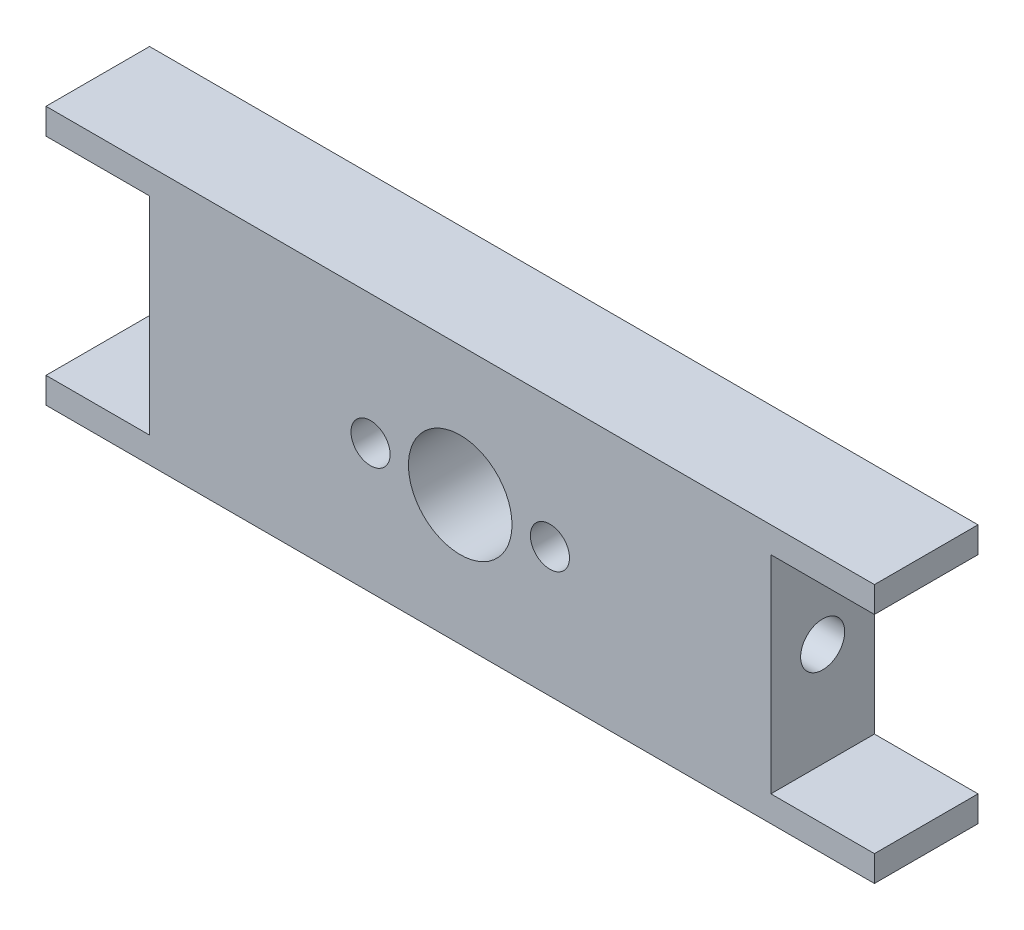
ISO-10303-21;
HEADER;
FILE_DESCRIPTION(('STEP AP214'),'2;1');
FILE_NAME('part.step','',(''),(''),'','','');
FILE_SCHEMA(('AUTOMOTIVE_DESIGN { 1 0 10303 214 1 1 1 1 }'));
ENDSEC;
DATA;
#1=APPLICATION_CONTEXT('core data for automotive mechanical design processes');
#2=APPLICATION_PROTOCOL_DEFINITION('international standard','automotive_design',2000,#1);
#3=PRODUCT_CONTEXT('',#1,'mechanical');
#4=PRODUCT('Part','Part','',(#3));
#5=PRODUCT_RELATED_PRODUCT_CATEGORY('part','',(#4));
#6=PRODUCT_DEFINITION_FORMATION('','',#4);
#7=PRODUCT_DEFINITION_CONTEXT('part definition',#1,'design');
#8=PRODUCT_DEFINITION('design','',#6,#7);
#9=PRODUCT_DEFINITION_SHAPE('','',#8);
#10=(LENGTH_UNIT() NAMED_UNIT(*) SI_UNIT(.MILLI.,.METRE.));
#11=(NAMED_UNIT(*) PLANE_ANGLE_UNIT() SI_UNIT($,.RADIAN.));
#12=(NAMED_UNIT(*) SI_UNIT($,.STERADIAN.) SOLID_ANGLE_UNIT());
#13=UNCERTAINTY_MEASURE_WITH_UNIT(LENGTH_MEASURE(1.E-05),#10,'distance_accuracy_value','');
#14=(GEOMETRIC_REPRESENTATION_CONTEXT(3) GLOBAL_UNCERTAINTY_ASSIGNED_CONTEXT((#13)) GLOBAL_UNIT_ASSIGNED_CONTEXT((#10,
#11,#12)) REPRESENTATION_CONTEXT('',''));
#15=CARTESIAN_POINT('',(0.,0.,0.));
#16=DIRECTION('',(0.,0.,1.));
#17=DIRECTION('',(1.,0.,0.));
#18=AXIS2_PLACEMENT_3D('',#15,#16,#17);
#19=CARTESIAN_POINT('',(0.,0.,6.35));
#20=DIRECTION('',(0.,0.,-1.));
#21=DIRECTION('',(-1.,0.,0.));
#22=AXIS2_PLACEMENT_3D('',#19,#20,#21);
#23=PLANE('',#22);
#24=CARTESIAN_POINT('',(5.50000000000001,0.,6.34999999999999));
#25=DIRECTION('',(0.,0.,-1.));
#26=DIRECTION('',(-1.,0.,0.));
#27=AXIS2_PLACEMENT_3D('',#24,#25,#26);
#28=CIRCLE('',#27,1.19999999999999);
#29=CARTESIAN_POINT('',(4.30000000000002,0.,6.34999999999999));
#30=VERTEX_POINT('',#29);
#31=EDGE_CURVE('E321',#30,#30,#28,.T.);
#32=ORIENTED_EDGE('',*,*,#31,.T.);
#33=EDGE_LOOP('',(#32));
#34=FACE_BOUND('',#33,.T.);
#35=CARTESIAN_POINT('',(-5.5,0.,6.34999999999999));
#36=DIRECTION('',(0.,0.,-1.));
#37=DIRECTION('',(-1.,0.,0.));
#38=AXIS2_PLACEMENT_3D('',#35,#36,#37);
#39=CIRCLE('',#38,1.19999999999999);
#40=CARTESIAN_POINT('',(-6.69999999999999,0.,6.34999999999999));
#41=VERTEX_POINT('',#40);
#42=EDGE_CURVE('E329',#41,#41,#39,.T.);
#43=ORIENTED_EDGE('',*,*,#42,.T.);
#44=EDGE_LOOP('',(#43));
#45=FACE_BOUND('',#44,.T.);
#46=DIRECTION('',(0.,1.,0.));
#47=VECTOR('',#46,1.);
#48=CARTESIAN_POINT('',(25.4,7.9375,6.35));
#49=LINE('',#48,#47);
#50=CARTESIAN_POINT('',(25.4,6.35,6.35));
#51=VERTEX_POINT('',#50);
#52=CARTESIAN_POINT('',(25.4,7.9375,6.35));
#53=VERTEX_POINT('',#52);
#54=EDGE_CURVE('E180',#51,#53,#49,.T.);
#55=ORIENTED_EDGE('',*,*,#54,.T.);
#56=DIRECTION('',(-1.,0.,0.));
#57=VECTOR('',#56,1.);
#58=CARTESIAN_POINT('',(25.4,7.9375,6.35));
#59=LINE('',#58,#57);
#60=CARTESIAN_POINT('',(-25.4,7.9375,6.35));
#61=VERTEX_POINT('',#60);
#62=EDGE_CURVE('E106',#53,#61,#59,.T.);
#63=ORIENTED_EDGE('',*,*,#62,.T.);
#64=DIRECTION('',(0.,-1.,0.));
#65=VECTOR('',#64,1.);
#66=CARTESIAN_POINT('',(-25.4,7.9375,6.35));
#67=LINE('',#66,#65);
#68=CARTESIAN_POINT('',(-25.4,6.35,6.35));
#69=VERTEX_POINT('',#68);
#70=EDGE_CURVE('E207',#61,#69,#67,.T.);
#71=ORIENTED_EDGE('',*,*,#70,.T.);
#72=DIRECTION('',(1.,0.,0.));
#73=VECTOR('',#72,1.);
#74=CARTESIAN_POINT('',(-25.4,6.35,6.35));
#75=LINE('',#74,#73);
#76=CARTESIAN_POINT('',(-19.05,6.35,6.35));
#77=VERTEX_POINT('',#76);
#78=EDGE_CURVE('E226',#69,#77,#75,.T.);
#79=ORIENTED_EDGE('',*,*,#78,.T.);
#80=DIRECTION('',(0.,-1.,0.));
#81=VECTOR('',#80,1.);
#82=CARTESIAN_POINT('',(-19.05,6.35,6.35));
#83=LINE('',#82,#81);
#84=CARTESIAN_POINT('',(-19.05,-6.35,6.35));
#85=VERTEX_POINT('',#84);
#86=EDGE_CURVE('E223',#77,#85,#83,.T.);
#87=ORIENTED_EDGE('',*,*,#86,.T.);
#88=DIRECTION('',(-1.,0.,0.));
#89=VECTOR('',#88,1.);
#90=CARTESIAN_POINT('',(-25.4,-6.35,6.35));
#91=LINE('',#90,#89);
#92=CARTESIAN_POINT('',(-25.4,-6.35,6.35));
#93=VERTEX_POINT('',#92);
#94=EDGE_CURVE('E225',#85,#93,#91,.T.);
#95=ORIENTED_EDGE('',*,*,#94,.T.);
#96=DIRECTION('',(0.,-1.,0.));
#97=VECTOR('',#96,1.);
#98=CARTESIAN_POINT('',(-25.4,-6.35,6.35));
#99=LINE('',#98,#97);
#100=CARTESIAN_POINT('',(-25.4,-7.9375,6.35));
#101=VERTEX_POINT('',#100);
#102=EDGE_CURVE('E228',#93,#101,#99,.T.);
#103=ORIENTED_EDGE('',*,*,#102,.T.);
#104=DIRECTION('',(1.,0.,0.));
#105=VECTOR('',#104,1.);
#106=CARTESIAN_POINT('',(25.4,-7.9375,6.35));
#107=LINE('',#106,#105);
#108=CARTESIAN_POINT('',(25.4,-7.9375,6.35));
#109=VERTEX_POINT('',#108);
#110=EDGE_CURVE('E234',#101,#109,#107,.T.);
#111=ORIENTED_EDGE('',*,*,#110,.T.);
#112=DIRECTION('',(0.,1.,0.));
#113=VECTOR('',#112,1.);
#114=CARTESIAN_POINT('',(25.4,-6.35,6.35));
#115=LINE('',#114,#113);
#116=CARTESIAN_POINT('',(25.4,-6.35,6.35));
#117=VERTEX_POINT('',#116);
#118=EDGE_CURVE('E139',#109,#117,#115,.T.);
#119=ORIENTED_EDGE('',*,*,#118,.T.);
#120=DIRECTION('',(-1.,0.,0.));
#121=VECTOR('',#120,1.);
#122=CARTESIAN_POINT('',(25.4,-6.35,6.35));
#123=LINE('',#122,#121);
#124=CARTESIAN_POINT('',(19.05,-6.35,6.35));
#125=VERTEX_POINT('',#124);
#126=EDGE_CURVE('E133',#117,#125,#123,.T.);
#127=ORIENTED_EDGE('',*,*,#126,.T.);
#128=DIRECTION('',(0.,1.,0.));
#129=VECTOR('',#128,1.);
#130=CARTESIAN_POINT('',(19.05,6.35,6.35));
#131=LINE('',#130,#129);
#132=CARTESIAN_POINT('',(19.05,6.35,6.35));
#133=VERTEX_POINT('',#132);
#134=EDGE_CURVE('E137',#125,#133,#131,.T.);
#135=ORIENTED_EDGE('',*,*,#134,.T.);
#136=DIRECTION('',(1.,0.,0.));
#137=VECTOR('',#136,1.);
#138=CARTESIAN_POINT('',(25.4,6.35,6.35));
#139=LINE('',#138,#137);
#140=EDGE_CURVE('E50',#133,#51,#139,.T.);
#141=ORIENTED_EDGE('',*,*,#140,.T.);
#142=EDGE_LOOP('',(#55,#63,#71,#79,#87,#95,#103,#111,#119,#127,#135,#141));
#143=FACE_BOUND('',#142,.T.);
#144=CARTESIAN_POINT('',(0.,0.,6.35));
#145=DIRECTION('',(0.,0.,1.));
#146=DIRECTION('',(1.,0.,0.));
#147=AXIS2_PLACEMENT_3D('',#144,#145,#146);
#148=CIRCLE('',#147,3.175);
#149=CARTESIAN_POINT('',(3.175,0.,6.35));
#150=VERTEX_POINT('',#149);
#151=EDGE_CURVE('E161',#150,#150,#148,.T.);
#152=ORIENTED_EDGE('',*,*,#151,.F.);
#153=EDGE_LOOP('',(#152));
#154=FACE_BOUND('',#153,.T.);
#155=ADVANCED_FACE('F33',(#34,#45,#143,#154),#23,.F.);
#156=CARTESIAN_POINT('',(0.,0.,0.));
#157=DIRECTION('',(0.,0.,-1.));
#158=DIRECTION('',(-1.,0.,0.));
#159=AXIS2_PLACEMENT_3D('',#156,#157,#158);
#160=PLANE('',#159);
#161=CARTESIAN_POINT('',(5.50000000000001,0.,0.));
#162=DIRECTION('',(0.,0.,-1.));
#163=DIRECTION('',(-1.,0.,0.));
#164=AXIS2_PLACEMENT_3D('',#161,#162,#163);
#165=CIRCLE('',#164,1.225);
#166=CARTESIAN_POINT('',(4.275,0.,0.));
#167=VERTEX_POINT('',#166);
#168=EDGE_CURVE('E313',#167,#167,#165,.T.);
#169=ORIENTED_EDGE('',*,*,#168,.F.);
#170=EDGE_LOOP('',(#169));
#171=FACE_BOUND('',#170,.T.);
#172=CARTESIAN_POINT('',(-5.5,0.,0.));
#173=DIRECTION('',(0.,0.,-1.));
#174=DIRECTION('',(-1.,0.,0.));
#175=AXIS2_PLACEMENT_3D('',#172,#173,#174);
#176=CIRCLE('',#175,1.225);
#177=CARTESIAN_POINT('',(-6.725,0.,0.));
#178=VERTEX_POINT('',#177);
#179=EDGE_CURVE('E323',#178,#178,#176,.T.);
#180=ORIENTED_EDGE('',*,*,#179,.F.);
#181=EDGE_LOOP('',(#180));
#182=FACE_BOUND('',#181,.T.);
#183=DIRECTION('',(0.,1.,0.));
#184=VECTOR('',#183,1.);
#185=CARTESIAN_POINT('',(25.4,7.9375,0.));
#186=LINE('',#185,#184);
#187=CARTESIAN_POINT('',(25.4,6.35,0.));
#188=VERTEX_POINT('',#187);
#189=CARTESIAN_POINT('',(25.4,7.9375,0.));
#190=VERTEX_POINT('',#189);
#191=EDGE_CURVE('E157',#188,#190,#186,.T.);
#192=ORIENTED_EDGE('',*,*,#191,.F.);
#193=DIRECTION('',(1.,0.,0.));
#194=VECTOR('',#193,1.);
#195=CARTESIAN_POINT('',(25.4,6.35,0.));
#196=LINE('',#195,#194);
#197=CARTESIAN_POINT('',(19.05,6.35,0.));
#198=VERTEX_POINT('',#197);
#199=EDGE_CURVE('E98',#198,#188,#196,.T.);
#200=ORIENTED_EDGE('',*,*,#199,.F.);
#201=DIRECTION('',(0.,1.,0.));
#202=VECTOR('',#201,1.);
#203=CARTESIAN_POINT('',(19.05,6.35,0.));
#204=LINE('',#203,#202);
#205=CARTESIAN_POINT('',(19.05,-6.35,0.));
#206=VERTEX_POINT('',#205);
#207=EDGE_CURVE('E92',#206,#198,#204,.T.);
#208=ORIENTED_EDGE('',*,*,#207,.F.);
#209=DIRECTION('',(-1.,0.,0.));
#210=VECTOR('',#209,1.);
#211=CARTESIAN_POINT('',(25.4,-6.35,0.));
#212=LINE('',#211,#210);
#213=CARTESIAN_POINT('',(25.4,-6.35,0.));
#214=VERTEX_POINT('',#213);
#215=EDGE_CURVE('E147',#214,#206,#212,.T.);
#216=ORIENTED_EDGE('',*,*,#215,.F.);
#217=DIRECTION('',(0.,1.,0.));
#218=VECTOR('',#217,1.);
#219=CARTESIAN_POINT('',(25.4,-6.35,0.));
#220=LINE('',#219,#218);
#221=CARTESIAN_POINT('',(25.4,-7.9375,0.));
#222=VERTEX_POINT('',#221);
#223=EDGE_CURVE('E175',#222,#214,#220,.T.);
#224=ORIENTED_EDGE('',*,*,#223,.F.);
#225=DIRECTION('',(1.,0.,0.));
#226=VECTOR('',#225,1.);
#227=CARTESIAN_POINT('',(25.4,-7.9375,0.));
#228=LINE('',#227,#226);
#229=CARTESIAN_POINT('',(-25.4,-7.9375,0.));
#230=VERTEX_POINT('',#229);
#231=EDGE_CURVE('E173',#230,#222,#228,.T.);
#232=ORIENTED_EDGE('',*,*,#231,.F.);
#233=DIRECTION('',(0.,-1.,0.));
#234=VECTOR('',#233,1.);
#235=CARTESIAN_POINT('',(-25.4,-6.35,0.));
#236=LINE('',#235,#234);
#237=CARTESIAN_POINT('',(-25.4,-6.35,0.));
#238=VERTEX_POINT('',#237);
#239=EDGE_CURVE('E171',#238,#230,#236,.T.);
#240=ORIENTED_EDGE('',*,*,#239,.F.);
#241=DIRECTION('',(-1.,0.,0.));
#242=VECTOR('',#241,1.);
#243=CARTESIAN_POINT('',(-25.4,-6.35,0.));
#244=LINE('',#243,#242);
#245=CARTESIAN_POINT('',(-19.05,-6.35,0.));
#246=VERTEX_POINT('',#245);
#247=EDGE_CURVE('E169',#246,#238,#244,.T.);
#248=ORIENTED_EDGE('',*,*,#247,.F.);
#249=DIRECTION('',(0.,-1.,0.));
#250=VECTOR('',#249,1.);
#251=CARTESIAN_POINT('',(-19.05,6.35,0.));
#252=LINE('',#251,#250);
#253=CARTESIAN_POINT('',(-19.05,6.35,0.));
#254=VERTEX_POINT('',#253);
#255=EDGE_CURVE('E167',#254,#246,#252,.T.);
#256=ORIENTED_EDGE('',*,*,#255,.F.);
#257=DIRECTION('',(1.,0.,0.));
#258=VECTOR('',#257,1.);
#259=CARTESIAN_POINT('',(-25.4,6.35,0.));
#260=LINE('',#259,#258);
#261=CARTESIAN_POINT('',(-25.4,6.35,0.));
#262=VERTEX_POINT('',#261);
#263=EDGE_CURVE('E165',#262,#254,#260,.T.);
#264=ORIENTED_EDGE('',*,*,#263,.F.);
#265=DIRECTION('',(0.,-1.,0.));
#266=VECTOR('',#265,1.);
#267=CARTESIAN_POINT('',(-25.4,7.9375,0.));
#268=LINE('',#267,#266);
#269=CARTESIAN_POINT('',(-25.4,7.9375,0.));
#270=VERTEX_POINT('',#269);
#271=EDGE_CURVE('E163',#270,#262,#268,.T.);
#272=ORIENTED_EDGE('',*,*,#271,.F.);
#273=DIRECTION('',(-1.,0.,0.));
#274=VECTOR('',#273,1.);
#275=CARTESIAN_POINT('',(25.4,7.9375,0.));
#276=LINE('',#275,#274);
#277=EDGE_CURVE('E160',#190,#270,#276,.T.);
#278=ORIENTED_EDGE('',*,*,#277,.F.);
#279=EDGE_LOOP('',(#192,#200,#208,#216,#224,#232,#240,#248,#256,#264,#272,#278));
#280=FACE_BOUND('',#279,.T.);
#281=CARTESIAN_POINT('',(0.,0.,0.));
#282=DIRECTION('',(0.,0.,1.));
#283=DIRECTION('',(1.,0.,0.));
#284=AXIS2_PLACEMENT_3D('',#281,#282,#283);
#285=CIRCLE('',#284,3.175);
#286=CARTESIAN_POINT('',(3.175,0.,0.));
#287=VERTEX_POINT('',#286);
#288=EDGE_CURVE('E338',#287,#287,#285,.T.);
#289=ORIENTED_EDGE('',*,*,#288,.T.);
#290=EDGE_LOOP('',(#289));
#291=FACE_BOUND('',#290,.T.);
#292=ADVANCED_FACE('F211',(#171,#182,#280,#291),#160,.T.);
#293=CARTESIAN_POINT('',(25.4,7.9375,6.35));
#294=DIRECTION('',(-1.,0.,0.));
#295=DIRECTION('',(0.,0.,1.));
#296=AXIS2_PLACEMENT_3D('',#293,#294,#295);
#297=PLANE('',#296);
#298=ORIENTED_EDGE('',*,*,#191,.T.);
#299=DIRECTION('',(0.,0.,-1.));
#300=VECTOR('',#299,1.);
#301=CARTESIAN_POINT('',(25.4,7.9375,6.35));
#302=LINE('',#301,#300);
#303=EDGE_CURVE('E11',#53,#190,#302,.T.);
#304=ORIENTED_EDGE('',*,*,#303,.F.);
#305=ORIENTED_EDGE('',*,*,#54,.F.);
#306=DIRECTION('',(0.,0.,-1.));
#307=VECTOR('',#306,1.);
#308=CARTESIAN_POINT('',(25.4,6.35,6.35));
#309=LINE('',#308,#307);
#310=EDGE_CURVE('E153',#51,#188,#309,.T.);
#311=ORIENTED_EDGE('',*,*,#310,.T.);
#312=EDGE_LOOP('',(#298,#304,#305,#311));
#313=FACE_BOUND('',#312,.T.);
#314=ADVANCED_FACE('F35',(#313),#297,.F.);
#315=CARTESIAN_POINT('',(25.4,7.9375,6.35));
#316=DIRECTION('',(0.,-1.,0.));
#317=DIRECTION('',(1.,0.,0.));
#318=AXIS2_PLACEMENT_3D('',#315,#316,#317);
#319=PLANE('',#318);
#320=ORIENTED_EDGE('',*,*,#277,.T.);
#321=DIRECTION('',(0.,0.,-1.));
#322=VECTOR('',#321,1.);
#323=CARTESIAN_POINT('',(-25.4,7.9375,6.35));
#324=LINE('',#323,#322);
#325=EDGE_CURVE('E42',#61,#270,#324,.T.);
#326=ORIENTED_EDGE('',*,*,#325,.F.);
#327=ORIENTED_EDGE('',*,*,#62,.F.);
#328=ORIENTED_EDGE('',*,*,#303,.T.);
#329=EDGE_LOOP('',(#320,#326,#327,#328));
#330=FACE_BOUND('',#329,.T.);
#331=ADVANCED_FACE('F377',(#330),#319,.F.);
#332=CARTESIAN_POINT('',(-25.4,7.9375,6.35));
#333=DIRECTION('',(1.,0.,0.));
#334=DIRECTION('',(0.,0.,-1.));
#335=AXIS2_PLACEMENT_3D('',#332,#333,#334);
#336=PLANE('',#335);
#337=ORIENTED_EDGE('',*,*,#271,.T.);
#338=DIRECTION('',(0.,0.,-1.));
#339=VECTOR('',#338,1.);
#340=CARTESIAN_POINT('',(-25.4,6.35,6.35));
#341=LINE('',#340,#339);
#342=EDGE_CURVE('E199',#69,#262,#341,.T.);
#343=ORIENTED_EDGE('',*,*,#342,.F.);
#344=ORIENTED_EDGE('',*,*,#70,.F.);
#345=ORIENTED_EDGE('',*,*,#325,.T.);
#346=EDGE_LOOP('',(#337,#343,#344,#345));
#347=FACE_BOUND('',#346,.T.);
#348=ADVANCED_FACE('F205',(#347),#336,.F.);
#349=CARTESIAN_POINT('',(-25.4,6.35,6.35));
#350=DIRECTION('',(0.,1.,0.));
#351=DIRECTION('',(-1.,0.,0.));
#352=AXIS2_PLACEMENT_3D('',#349,#350,#351);
#353=PLANE('',#352);
#354=ORIENTED_EDGE('',*,*,#263,.T.);
#355=DIRECTION('',(0.,0.,-1.));
#356=VECTOR('',#355,1.);
#357=CARTESIAN_POINT('',(-19.05,6.35,6.35));
#358=LINE('',#357,#356);
#359=EDGE_CURVE('E196',#77,#254,#358,.T.);
#360=ORIENTED_EDGE('',*,*,#359,.F.);
#361=ORIENTED_EDGE('',*,*,#78,.F.);
#362=ORIENTED_EDGE('',*,*,#342,.T.);
#363=EDGE_LOOP('',(#354,#360,#361,#362));
#364=FACE_BOUND('',#363,.T.);
#365=ADVANCED_FACE('F217',(#364),#353,.F.);
#366=CARTESIAN_POINT('',(-19.05,6.35,6.35));
#367=DIRECTION('',(1.,0.,0.));
#368=DIRECTION('',(0.,0.,-1.));
#369=AXIS2_PLACEMENT_3D('',#366,#367,#368);
#370=PLANE('',#369);
#371=CARTESIAN_POINT('',(-19.05,-2.53269627492614E-13,3.17500000000133));
#372=DIRECTION('',(-1.,0.,0.));
#373=DIRECTION('',(0.,0.,1.));
#374=AXIS2_PLACEMENT_3D('',#371,#372,#373);
#375=CIRCLE('',#374,1.35254999999999);
#376=CARTESIAN_POINT('',(-19.05,-2.53269627492614E-13,4.52755000000132));
#377=VERTEX_POINT('',#376);
#378=EDGE_CURVE('E310',#377,#377,#375,.T.);
#379=ORIENTED_EDGE('',*,*,#378,.F.);
#380=EDGE_LOOP('',(#379));
#381=FACE_BOUND('',#380,.T.);
#382=ORIENTED_EDGE('',*,*,#255,.T.);
#383=DIRECTION('',(0.,0.,-1.));
#384=VECTOR('',#383,1.);
#385=CARTESIAN_POINT('',(-19.05,-6.35,6.35));
#386=LINE('',#385,#384);
#387=EDGE_CURVE('E193',#85,#246,#386,.T.);
#388=ORIENTED_EDGE('',*,*,#387,.F.);
#389=ORIENTED_EDGE('',*,*,#86,.F.);
#390=ORIENTED_EDGE('',*,*,#359,.T.);
#391=EDGE_LOOP('',(#382,#388,#389,#390));
#392=FACE_BOUND('',#391,.T.);
#393=ADVANCED_FACE('F221',(#381,#392),#370,.F.);
#394=CARTESIAN_POINT('',(-25.4,-6.35,6.35));
#395=DIRECTION('',(0.,-1.,0.));
#396=DIRECTION('',(1.,0.,0.));
#397=AXIS2_PLACEMENT_3D('',#394,#395,#396);
#398=PLANE('',#397);
#399=ORIENTED_EDGE('',*,*,#247,.T.);
#400=DIRECTION('',(0.,0.,-1.));
#401=VECTOR('',#400,1.);
#402=CARTESIAN_POINT('',(-25.4,-6.35,6.35));
#403=LINE('',#402,#401);
#404=EDGE_CURVE('E190',#93,#238,#403,.T.);
#405=ORIENTED_EDGE('',*,*,#404,.F.);
#406=ORIENTED_EDGE('',*,*,#94,.F.);
#407=ORIENTED_EDGE('',*,*,#387,.T.);
#408=EDGE_LOOP('',(#399,#405,#406,#407));
#409=FACE_BOUND('',#408,.T.);
#410=ADVANCED_FACE('F364',(#409),#398,.F.);
#411=CARTESIAN_POINT('',(-25.4,-6.35,6.35));
#412=DIRECTION('',(1.,0.,0.));
#413=DIRECTION('',(0.,0.,-1.));
#414=AXIS2_PLACEMENT_3D('',#411,#412,#413);
#415=PLANE('',#414);
#416=ORIENTED_EDGE('',*,*,#239,.T.);
#417=DIRECTION('',(0.,0.,-1.));
#418=VECTOR('',#417,1.);
#419=CARTESIAN_POINT('',(-25.4,-7.9375,6.35));
#420=LINE('',#419,#418);
#421=EDGE_CURVE('E187',#101,#230,#420,.T.);
#422=ORIENTED_EDGE('',*,*,#421,.F.);
#423=ORIENTED_EDGE('',*,*,#102,.F.);
#424=ORIENTED_EDGE('',*,*,#404,.T.);
#425=EDGE_LOOP('',(#416,#422,#423,#424));
#426=FACE_BOUND('',#425,.T.);
#427=ADVANCED_FACE('F370',(#426),#415,.F.);
#428=CARTESIAN_POINT('',(25.4,-7.9375,6.35));
#429=DIRECTION('',(0.,1.,0.));
#430=DIRECTION('',(-1.,0.,0.));
#431=AXIS2_PLACEMENT_3D('',#428,#429,#430);
#432=PLANE('',#431);
#433=ORIENTED_EDGE('',*,*,#231,.T.);
#434=DIRECTION('',(0.,0.,-1.));
#435=VECTOR('',#434,1.);
#436=CARTESIAN_POINT('',(25.4,-7.9375,6.35));
#437=LINE('',#436,#435);
#438=EDGE_CURVE('E184',#109,#222,#437,.T.);
#439=ORIENTED_EDGE('',*,*,#438,.F.);
#440=ORIENTED_EDGE('',*,*,#110,.F.);
#441=ORIENTED_EDGE('',*,*,#421,.T.);
#442=EDGE_LOOP('',(#433,#439,#440,#441));
#443=FACE_BOUND('',#442,.T.);
#444=ADVANCED_FACE('F240',(#443),#432,.F.);
#445=CARTESIAN_POINT('',(25.4,-6.35,6.35));
#446=DIRECTION('',(-1.,0.,0.));
#447=DIRECTION('',(0.,0.,1.));
#448=AXIS2_PLACEMENT_3D('',#445,#446,#447);
#449=PLANE('',#448);
#450=ORIENTED_EDGE('',*,*,#223,.T.);
#451=DIRECTION('',(0.,0.,-1.));
#452=VECTOR('',#451,1.);
#453=CARTESIAN_POINT('',(25.4,-6.35,6.35));
#454=LINE('',#453,#452);
#455=EDGE_CURVE('E148',#117,#214,#454,.T.);
#456=ORIENTED_EDGE('',*,*,#455,.F.);
#457=ORIENTED_EDGE('',*,*,#118,.F.);
#458=ORIENTED_EDGE('',*,*,#438,.T.);
#459=EDGE_LOOP('',(#450,#456,#457,#458));
#460=FACE_BOUND('',#459,.T.);
#461=ADVANCED_FACE('F244',(#460),#449,.F.);
#462=CARTESIAN_POINT('',(25.4,-6.35,6.35));
#463=DIRECTION('',(0.,-1.,0.));
#464=DIRECTION('',(1.,0.,0.));
#465=AXIS2_PLACEMENT_3D('',#462,#463,#464);
#466=PLANE('',#465);
#467=ORIENTED_EDGE('',*,*,#215,.T.);
#468=DIRECTION('',(0.,0.,-1.));
#469=VECTOR('',#468,1.);
#470=CARTESIAN_POINT('',(19.05,-6.35,6.35));
#471=LINE('',#470,#469);
#472=EDGE_CURVE('E144',#125,#206,#471,.T.);
#473=ORIENTED_EDGE('',*,*,#472,.F.);
#474=ORIENTED_EDGE('',*,*,#126,.F.);
#475=ORIENTED_EDGE('',*,*,#455,.T.);
#476=EDGE_LOOP('',(#467,#473,#474,#475));
#477=FACE_BOUND('',#476,.T.);
#478=ADVANCED_FACE('F145',(#477),#466,.F.);
#479=CARTESIAN_POINT('',(19.05,6.35,6.35));
#480=DIRECTION('',(-1.,0.,0.));
#481=DIRECTION('',(0.,0.,1.));
#482=AXIS2_PLACEMENT_3D('',#479,#480,#481);
#483=PLANE('',#482);
#484=CARTESIAN_POINT('',(19.05,-2.58473797920544E-13,3.17500000000133));
#485=DIRECTION('',(1.,0.,0.));
#486=DIRECTION('',(0.,0.,-1.));
#487=AXIS2_PLACEMENT_3D('',#484,#485,#486);
#488=CIRCLE('',#487,1.35254999999999);
#489=CARTESIAN_POINT('',(19.05,-2.58473797920544E-13,1.82245000000134));
#490=VERTEX_POINT('',#489);
#491=EDGE_CURVE('E332',#490,#490,#488,.T.);
#492=ORIENTED_EDGE('',*,*,#491,.F.);
#493=EDGE_LOOP('',(#492));
#494=FACE_BOUND('',#493,.T.);
#495=ORIENTED_EDGE('',*,*,#207,.T.);
#496=DIRECTION('',(0.,0.,-1.));
#497=VECTOR('',#496,1.);
#498=CARTESIAN_POINT('',(19.05,6.35,6.35));
#499=LINE('',#498,#497);
#500=EDGE_CURVE('E149',#133,#198,#499,.T.);
#501=ORIENTED_EDGE('',*,*,#500,.F.);
#502=ORIENTED_EDGE('',*,*,#134,.F.);
#503=ORIENTED_EDGE('',*,*,#472,.T.);
#504=EDGE_LOOP('',(#495,#501,#502,#503));
#505=FACE_BOUND('',#504,.T.);
#506=ADVANCED_FACE('F151',(#494,#505),#483,.F.);
#507=CARTESIAN_POINT('',(25.4,6.35,6.35));
#508=DIRECTION('',(0.,1.,0.));
#509=DIRECTION('',(-1.,0.,0.));
#510=AXIS2_PLACEMENT_3D('',#507,#508,#509);
#511=PLANE('',#510);
#512=ORIENTED_EDGE('',*,*,#199,.T.);
#513=ORIENTED_EDGE('',*,*,#310,.F.);
#514=ORIENTED_EDGE('',*,*,#140,.F.);
#515=ORIENTED_EDGE('',*,*,#500,.T.);
#516=EDGE_LOOP('',(#512,#513,#514,#515));
#517=FACE_BOUND('',#516,.T.);
#518=ADVANCED_FACE('F248',(#517),#511,.F.);
#519=CARTESIAN_POINT('',(0.,0.,6.35));
#520=DIRECTION('',(0.,0.,-1.));
#521=DIRECTION('',(-1.,0.,0.));
#522=AXIS2_PLACEMENT_3D('',#519,#520,#521);
#523=CYLINDRICAL_SURFACE('',#522,3.175);
#524=ORIENTED_EDGE('',*,*,#151,.T.);
#525=EDGE_LOOP('',(#524));
#526=FACE_BOUND('',#525,.T.);
#527=ORIENTED_EDGE('',*,*,#288,.F.);
#528=EDGE_LOOP('',(#527));
#529=FACE_BOUND('',#528,.T.);
#530=ADVANCED_FACE('F250',(#526,#529),#523,.F.);
#531=CARTESIAN_POINT('',(12.7,-2.58473797920544E-13,3.17500000000133));
#532=DIRECTION('',(1.,0.,0.));
#533=DIRECTION('',(0.,0.,-1.));
#534=AXIS2_PLACEMENT_3D('',#531,#532,#533);
#535=CONICAL_SURFACE('',#534,1.35255,1.02974425867665);
#536=CARTESIAN_POINT('',(11.8873059697343,-2.60228151984032E-13,3.17500000000133));
#537=VERTEX_POINT('',#536);
#538=VERTEX_LOOP('',#537);
#539=FACE_BOUND('',#538,.T.);
#540=CARTESIAN_POINT('',(12.7,-2.58473797920544E-13,3.17500000000133));
#541=DIRECTION('',(1.,0.,0.));
#542=DIRECTION('',(0.,0.,-1.));
#543=AXIS2_PLACEMENT_3D('',#540,#541,#542);
#544=CIRCLE('',#543,1.35255);
#545=CARTESIAN_POINT('',(12.7,-2.58473797920544E-13,1.82245000000133));
#546=VERTEX_POINT('',#545);
#547=EDGE_CURVE('E335',#546,#546,#544,.T.);
#548=ORIENTED_EDGE('',*,*,#547,.T.);
#549=EDGE_LOOP('',(#548));
#550=FACE_BOUND('',#549,.T.);
#551=ADVANCED_FACE('F256',(#539,#550),#535,.F.);
#552=CARTESIAN_POINT('',(19.05,-2.58473797920544E-13,3.17500000000133));
#553=DIRECTION('',(1.,0.,0.));
#554=DIRECTION('',(0.,0.,-1.));
#555=AXIS2_PLACEMENT_3D('',#552,#553,#554);
#556=CYLINDRICAL_SURFACE('',#555,1.35254999999999);
#557=ORIENTED_EDGE('',*,*,#547,.F.);
#558=EDGE_LOOP('',(#557));
#559=FACE_BOUND('',#558,.T.);
#560=ORIENTED_EDGE('',*,*,#491,.T.);
#561=EDGE_LOOP('',(#560));
#562=FACE_BOUND('',#561,.T.);
#563=ADVANCED_FACE('F274',(#559,#562),#556,.F.);
#564=CARTESIAN_POINT('',(-5.5,0.,0.));
#565=DIRECTION('',(0.,0.,-1.));
#566=DIRECTION('',(-1.,0.,0.));
#567=AXIS2_PLACEMENT_3D('',#564,#565,#566);
#568=CYLINDRICAL_SURFACE('',#567,1.19999999999999);
#569=ORIENTED_EDGE('',*,*,#42,.F.);
#570=EDGE_LOOP('',(#569));
#571=FACE_BOUND('',#570,.T.);
#572=CARTESIAN_POINT('',(-5.5,0.,0.0250000000000016));
#573=DIRECTION('',(0.,0.,-1.));
#574=DIRECTION('',(-1.,0.,0.));
#575=AXIS2_PLACEMENT_3D('',#572,#573,#574);
#576=CIRCLE('',#575,1.2);
#577=CARTESIAN_POINT('',(-6.7,0.,0.0250000000000016));
#578=VERTEX_POINT('',#577);
#579=EDGE_CURVE('E326',#578,#578,#576,.T.);
#580=ORIENTED_EDGE('',*,*,#579,.T.);
#581=EDGE_LOOP('',(#580));
#582=FACE_BOUND('',#581,.T.);
#583=ADVANCED_FACE('F278',(#571,#582),#568,.F.);
#584=CARTESIAN_POINT('',(-5.5,0.,0.));
#585=DIRECTION('',(0.,0.,-1.));
#586=DIRECTION('',(-1.,0.,0.));
#587=AXIS2_PLACEMENT_3D('',#584,#585,#586);
#588=CONICAL_SURFACE('',#587,1.225,0.785398163397414);
#589=ORIENTED_EDGE('',*,*,#579,.F.);
#590=EDGE_LOOP('',(#589));
#591=FACE_BOUND('',#590,.T.);
#592=ORIENTED_EDGE('',*,*,#179,.T.);
#593=EDGE_LOOP('',(#592));
#594=FACE_BOUND('',#593,.T.);
#595=ADVANCED_FACE('F282',(#591,#594),#588,.F.);
#596=CARTESIAN_POINT('',(5.50000000000001,0.,0.));
#597=DIRECTION('',(0.,0.,-1.));
#598=DIRECTION('',(-1.,0.,0.));
#599=AXIS2_PLACEMENT_3D('',#596,#597,#598);
#600=CYLINDRICAL_SURFACE('',#599,1.19999999999999);
#601=ORIENTED_EDGE('',*,*,#31,.F.);
#602=EDGE_LOOP('',(#601));
#603=FACE_BOUND('',#602,.T.);
#604=CARTESIAN_POINT('',(5.50000000000001,0.,0.0250000000000016));
#605=DIRECTION('',(0.,0.,-1.));
#606=DIRECTION('',(-1.,0.,0.));
#607=AXIS2_PLACEMENT_3D('',#604,#605,#606);
#608=CIRCLE('',#607,1.2);
#609=CARTESIAN_POINT('',(4.30000000000001,0.,0.0250000000000016));
#610=VERTEX_POINT('',#609);
#611=EDGE_CURVE('E318',#610,#610,#608,.T.);
#612=ORIENTED_EDGE('',*,*,#611,.T.);
#613=EDGE_LOOP('',(#612));
#614=FACE_BOUND('',#613,.T.);
#615=ADVANCED_FACE('F286',(#603,#614),#600,.F.);
#616=CARTESIAN_POINT('',(5.50000000000001,0.,0.));
#617=DIRECTION('',(0.,0.,-1.));
#618=DIRECTION('',(-1.,0.,0.));
#619=AXIS2_PLACEMENT_3D('',#616,#617,#618);
#620=CONICAL_SURFACE('',#619,1.225,0.785398163397414);
#621=ORIENTED_EDGE('',*,*,#611,.F.);
#622=EDGE_LOOP('',(#621));
#623=FACE_BOUND('',#622,.T.);
#624=ORIENTED_EDGE('',*,*,#168,.T.);
#625=EDGE_LOOP('',(#624));
#626=FACE_BOUND('',#625,.T.);
#627=ADVANCED_FACE('F290',(#623,#626),#620,.F.);
#628=CARTESIAN_POINT('',(-12.7,-2.53269627492614E-13,3.17500000000133));
#629=DIRECTION('',(-1.,0.,0.));
#630=DIRECTION('',(0.,0.,1.));
#631=AXIS2_PLACEMENT_3D('',#628,#629,#630);
#632=CONICAL_SURFACE('',#631,1.35255,1.02974425867665);
#633=CARTESIAN_POINT('',(-11.8873059697343,-2.55023981556101E-13,3.17500000000133));
#634=VERTEX_POINT('',#633);
#635=VERTEX_LOOP('',#634);
#636=FACE_BOUND('',#635,.T.);
#637=CARTESIAN_POINT('',(-12.7,-2.53269627492614E-13,3.17500000000133));
#638=DIRECTION('',(-1.,0.,0.));
#639=DIRECTION('',(0.,0.,1.));
#640=AXIS2_PLACEMENT_3D('',#637,#638,#639);
#641=CIRCLE('',#640,1.35255);
#642=CARTESIAN_POINT('',(-12.7,-2.53269627492614E-13,4.52755000000133));
#643=VERTEX_POINT('',#642);
#644=EDGE_CURVE('E307',#643,#643,#641,.T.);
#645=ORIENTED_EDGE('',*,*,#644,.T.);
#646=EDGE_LOOP('',(#645));
#647=FACE_BOUND('',#646,.T.);
#648=ADVANCED_FACE('F294',(#636,#647),#632,.F.);
#649=CARTESIAN_POINT('',(-19.05,-2.53269627492614E-13,3.17500000000133));
#650=DIRECTION('',(-1.,0.,0.));
#651=DIRECTION('',(0.,0.,1.));
#652=AXIS2_PLACEMENT_3D('',#649,#650,#651);
#653=CYLINDRICAL_SURFACE('',#652,1.35254999999999);
#654=ORIENTED_EDGE('',*,*,#644,.F.);
#655=EDGE_LOOP('',(#654));
#656=FACE_BOUND('',#655,.T.);
#657=ORIENTED_EDGE('',*,*,#378,.T.);
#658=EDGE_LOOP('',(#657));
#659=FACE_BOUND('',#658,.T.);
#660=ADVANCED_FACE('F298',(#656,#659),#653,.F.);
#661=CLOSED_SHELL('',(#155,#292,#314,#331,#348,#365,#393,#410,#427,#444,#461,#478,#506,#518,
#530,#551,#563,#583,#595,#615,#627,#648,#660));
#662=MANIFOLD_SOLID_BREP('B2',#661);
#663=ADVANCED_BREP_SHAPE_REPRESENTATION('',(#18,#662),#14);
#664=SHAPE_DEFINITION_REPRESENTATION(#9,#663);
ENDSEC;
END-ISO-10303-21;
